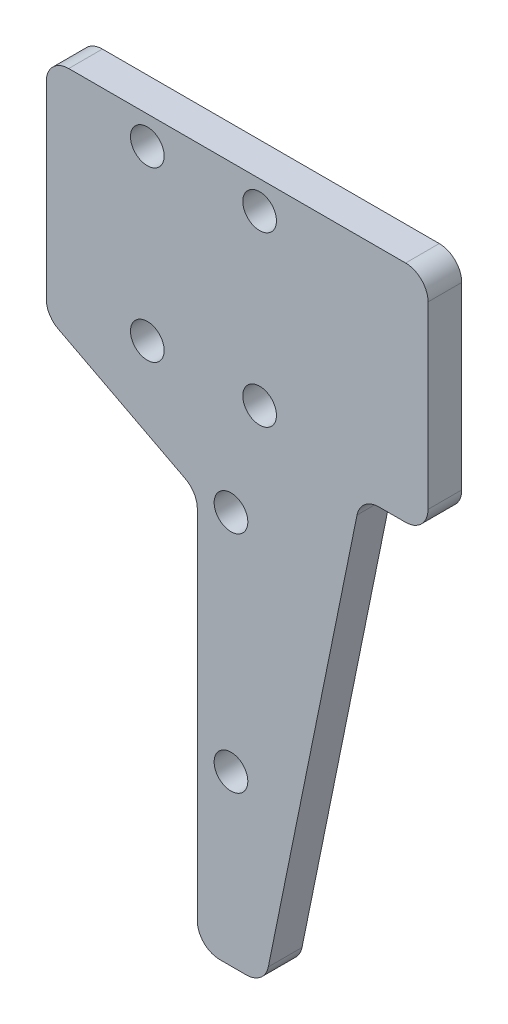
ISO-10303-21;
HEADER;
FILE_DESCRIPTION(('STEP AP214'),'2;1');
FILE_NAME('part.step','',(''),(''),'','','');
FILE_SCHEMA(('AUTOMOTIVE_DESIGN { 1 0 10303 214 1 1 1 1 }'));
ENDSEC;
DATA;
#1=APPLICATION_CONTEXT('core data for automotive mechanical design processes');
#2=APPLICATION_PROTOCOL_DEFINITION('international standard','automotive_design',2000,#1);
#3=PRODUCT_CONTEXT('',#1,'mechanical');
#4=PRODUCT('Part','Part','',(#3));
#5=PRODUCT_RELATED_PRODUCT_CATEGORY('part','',(#4));
#6=PRODUCT_DEFINITION_FORMATION('','',#4);
#7=PRODUCT_DEFINITION_CONTEXT('part definition',#1,'design');
#8=PRODUCT_DEFINITION('design','',#6,#7);
#9=PRODUCT_DEFINITION_SHAPE('','',#8);
#10=(LENGTH_UNIT() NAMED_UNIT(*) SI_UNIT(.MILLI.,.METRE.));
#11=(NAMED_UNIT(*) PLANE_ANGLE_UNIT() SI_UNIT($,.RADIAN.));
#12=(NAMED_UNIT(*) SI_UNIT($,.STERADIAN.) SOLID_ANGLE_UNIT());
#13=UNCERTAINTY_MEASURE_WITH_UNIT(LENGTH_MEASURE(1.E-05),#10,'distance_accuracy_value','');
#14=(GEOMETRIC_REPRESENTATION_CONTEXT(3) GLOBAL_UNCERTAINTY_ASSIGNED_CONTEXT((#13)) GLOBAL_UNIT_ASSIGNED_CONTEXT((#10,
#11,#12)) REPRESENTATION_CONTEXT('',''));
#15=CARTESIAN_POINT('',(0.,0.,0.));
#16=DIRECTION('',(0.,0.,1.));
#17=DIRECTION('',(1.,0.,0.));
#18=AXIS2_PLACEMENT_3D('',#15,#16,#17);
#19=CARTESIAN_POINT('',(0.,-52.,3.));
#20=DIRECTION('',(0.,1.,0.));
#21=DIRECTION('',(0.,0.,1.));
#22=AXIS2_PLACEMENT_3D('',#19,#20,#21);
#23=PLANE('',#22);
#24=DIRECTION('',(1.,0.,0.));
#25=VECTOR('',#24,1.);
#26=CARTESIAN_POINT('',(0.,-52.,3.));
#27=LINE('',#26,#25);
#28=CARTESIAN_POINT('',(1.45,-52.,3.));
#29=VERTEX_POINT('',#28);
#30=CARTESIAN_POINT('',(3.81612220410614,-52.,3.));
#31=VERTEX_POINT('',#30);
#32=EDGE_CURVE('E181',#29,#31,#27,.T.);
#33=ORIENTED_EDGE('',*,*,#32,.F.);
#34=DIRECTION('',(0.,0.,-1.));
#35=VECTOR('',#34,1.);
#36=CARTESIAN_POINT('',(1.45,-52.,3.));
#37=LINE('',#36,#35);
#38=CARTESIAN_POINT('',(1.45,-52.,0.));
#39=VERTEX_POINT('',#38);
#40=EDGE_CURVE('E166',#29,#39,#37,.T.);
#41=ORIENTED_EDGE('',*,*,#40,.T.);
#42=DIRECTION('',(1.,0.,0.));
#43=VECTOR('',#42,1.);
#44=CARTESIAN_POINT('',(0.,-52.,0.));
#45=LINE('',#44,#43);
#46=CARTESIAN_POINT('',(3.81612220410614,-52.,0.));
#47=VERTEX_POINT('',#46);
#48=EDGE_CURVE('E178',#39,#47,#45,.T.);
#49=ORIENTED_EDGE('',*,*,#48,.T.);
#50=DIRECTION('',(0.,0.,-1.));
#51=VECTOR('',#50,1.);
#52=CARTESIAN_POINT('',(3.81612220410614,-52.,3.));
#53=LINE('',#52,#51);
#54=EDGE_CURVE('E183',#47,#31,#53,.F.);
#55=ORIENTED_EDGE('',*,*,#54,.T.);
#56=EDGE_LOOP('',(#33,#41,#49,#55));
#57=FACE_BOUND('',#56,.T.);
#58=ADVANCED_FACE('F48',(#57),#23,.F.);
#59=CARTESIAN_POINT('',(15.3976166272704,-3.13451481340862,3.));
#60=DIRECTION('',(0.979901892234314,-0.199480028061985,0.));
#61=DIRECTION('',(0.199480028061986,0.979901892234314,0.));
#62=AXIS2_PLACEMENT_3D('',#59,#60,#61);
#63=PLANE('',#62);
#64=DIRECTION('',(-0.199480028061986,-0.979901892234314,0.));
#65=VECTOR('',#64,1.);
#66=CARTESIAN_POINT('',(15.3976166272704,-3.13451481340862,3.));
#67=LINE('',#66,#65);
#68=CARTESIAN_POINT('',(13.6740740114252,-11.601039943876,3.));
#69=VERTEX_POINT('',#68);
#70=CARTESIAN_POINT('',(5.77592598857476,-50.398960056124,3.));
#71=VERTEX_POINT('',#70);
#72=EDGE_CURVE('E295',#69,#71,#67,.T.);
#73=ORIENTED_EDGE('',*,*,#72,.T.);
#74=DIRECTION('',(0.,0.,-1.));
#75=VECTOR('',#74,1.);
#76=CARTESIAN_POINT('',(5.77592598857476,-50.398960056124,0.));
#77=LINE('',#76,#75);
#78=CARTESIAN_POINT('',(5.77592598857476,-50.398960056124,0.));
#79=VERTEX_POINT('',#78);
#80=EDGE_CURVE('E270',#71,#79,#77,.T.);
#81=ORIENTED_EDGE('',*,*,#80,.T.);
#82=DIRECTION('',(-0.199480028061986,-0.979901892234314,0.));
#83=VECTOR('',#82,1.);
#84=CARTESIAN_POINT('',(15.3976166272704,-3.13451481340862,0.));
#85=LINE('',#84,#83);
#86=CARTESIAN_POINT('',(13.6740740114252,-11.601039943876,0.));
#87=VERTEX_POINT('',#86);
#88=EDGE_CURVE('E188',#87,#79,#85,.T.);
#89=ORIENTED_EDGE('',*,*,#88,.F.);
#90=DIRECTION('',(0.,0.,-1.));
#91=VECTOR('',#90,1.);
#92=CARTESIAN_POINT('',(13.6740740114252,-11.601039943876,3.));
#93=LINE('',#92,#91);
#94=EDGE_CURVE('E268',#87,#69,#93,.F.);
#95=ORIENTED_EDGE('',*,*,#94,.T.);
#96=EDGE_LOOP('',(#73,#81,#89,#95));
#97=FACE_BOUND('',#96,.T.);
#98=ADVANCED_FACE('F285',(#97),#63,.T.);
#99=CARTESIAN_POINT('',(0.,10.,3.));
#100=DIRECTION('',(0.,1.,0.));
#101=DIRECTION('',(0.,0.,1.));
#102=AXIS2_PLACEMENT_3D('',#99,#100,#101);
#103=PLANE('',#102);
#104=DIRECTION('',(1.,0.,0.));
#105=VECTOR('',#104,1.);
#106=CARTESIAN_POINT('',(0.,10.,0.));
#107=LINE('',#106,#105);
#108=CARTESIAN_POINT('',(-12.,10.,0.));
#109=VERTEX_POINT('',#108);
#110=CARTESIAN_POINT('',(18.,10.,0.));
#111=VERTEX_POINT('',#110);
#112=EDGE_CURVE('E191',#109,#111,#107,.T.);
#113=ORIENTED_EDGE('',*,*,#112,.F.);
#114=DIRECTION('',(0.,0.,-1.));
#115=VECTOR('',#114,1.);
#116=CARTESIAN_POINT('',(-12.,10.,3.));
#117=LINE('',#116,#115);
#118=CARTESIAN_POINT('',(-12.,10.,3.));
#119=VERTEX_POINT('',#118);
#120=EDGE_CURVE('E255',#109,#119,#117,.F.);
#121=ORIENTED_EDGE('',*,*,#120,.T.);
#122=DIRECTION('',(1.,0.,0.));
#123=VECTOR('',#122,1.);
#124=CARTESIAN_POINT('',(0.,10.,3.));
#125=LINE('',#124,#123);
#126=CARTESIAN_POINT('',(18.,10.,3.));
#127=VERTEX_POINT('',#126);
#128=EDGE_CURVE('E317',#119,#127,#125,.T.);
#129=ORIENTED_EDGE('',*,*,#128,.T.);
#130=DIRECTION('',(0.,0.,1.));
#131=VECTOR('',#130,1.);
#132=CARTESIAN_POINT('',(18.,10.,3.));
#133=LINE('',#132,#131);
#134=EDGE_CURVE('E253',#127,#111,#133,.F.);
#135=ORIENTED_EDGE('',*,*,#134,.T.);
#136=EDGE_LOOP('',(#113,#121,#129,#135));
#137=FACE_BOUND('',#136,.T.);
#138=ADVANCED_FACE('F362',(#137),#103,.T.);
#139=CARTESIAN_POINT('',(-14.,0.,3.));
#140=DIRECTION('',(-1.,0.,0.));
#141=DIRECTION('',(0.,0.,1.));
#142=AXIS2_PLACEMENT_3D('',#139,#140,#141);
#143=PLANE('',#142);
#144=DIRECTION('',(0.,1.,0.));
#145=VECTOR('',#144,1.);
#146=CARTESIAN_POINT('',(-14.,0.,0.));
#147=LINE('',#146,#145);
#148=CARTESIAN_POINT('',(-14.,-8.78623998995418,0.));
#149=VERTEX_POINT('',#148);
#150=CARTESIAN_POINT('',(-14.,8.,0.));
#151=VERTEX_POINT('',#150);
#152=EDGE_CURVE('E202',#149,#151,#147,.T.);
#153=ORIENTED_EDGE('',*,*,#152,.F.);
#154=DIRECTION('',(0.,0.,-1.));
#155=VECTOR('',#154,1.);
#156=CARTESIAN_POINT('',(-14.,-8.78623998995418,3.));
#157=LINE('',#156,#155);
#158=CARTESIAN_POINT('',(-14.,-8.78623998995418,3.));
#159=VERTEX_POINT('',#158);
#160=EDGE_CURVE('E251',#149,#159,#157,.F.);
#161=ORIENTED_EDGE('',*,*,#160,.T.);
#162=DIRECTION('',(0.,1.,0.));
#163=VECTOR('',#162,1.);
#164=CARTESIAN_POINT('',(-14.,0.,3.));
#165=LINE('',#164,#163);
#166=CARTESIAN_POINT('',(-14.,8.,3.));
#167=VERTEX_POINT('',#166);
#168=EDGE_CURVE('E320',#159,#167,#165,.T.);
#169=ORIENTED_EDGE('',*,*,#168,.T.);
#170=DIRECTION('',(0.,0.,-1.));
#171=VECTOR('',#170,1.);
#172=CARTESIAN_POINT('',(-14.,8.,3.));
#173=LINE('',#172,#171);
#174=EDGE_CURVE('E248',#167,#151,#173,.T.);
#175=ORIENTED_EDGE('',*,*,#174,.T.);
#176=EDGE_LOOP('',(#153,#161,#169,#175));
#177=FACE_BOUND('',#176,.T.);
#178=ADVANCED_FACE('F404',(#177),#143,.T.);
#179=CARTESIAN_POINT('',(-7.07908787420755,-13.6019617011559,3.));
#180=DIRECTION('',(0.461664194486388,0.887054773691701,0.));
#181=DIRECTION('',(-0.887054773691701,0.461664194486388,0.));
#182=AXIS2_PLACEMENT_3D('',#179,#180,#181);
#183=PLANE('',#182);
#184=DIRECTION('',(0.887054773691701,-0.461664194486388,0.));
#185=VECTOR('',#184,1.);
#186=CARTESIAN_POINT('',(-7.07908787420755,-13.6019617011559,0.));
#187=LINE('',#186,#185);
#188=CARTESIAN_POINT('',(-12.9233283889728,-10.5603495373376,0.));
#189=VERTEX_POINT('',#188);
#190=CARTESIAN_POINT('',(-1.62667161102723,-16.4396504626624,0.));
#191=VERTEX_POINT('',#190);
#192=EDGE_CURVE('E205',#189,#191,#187,.T.);
#193=ORIENTED_EDGE('',*,*,#192,.T.);
#194=DIRECTION('',(0.,0.,-1.));
#195=VECTOR('',#194,1.);
#196=CARTESIAN_POINT('',(-1.62667161102723,-16.4396504626624,3.));
#197=LINE('',#196,#195);
#198=CARTESIAN_POINT('',(-1.62667161102723,-16.4396504626624,3.));
#199=VERTEX_POINT('',#198);
#200=EDGE_CURVE('E63',#191,#199,#197,.F.);
#201=ORIENTED_EDGE('',*,*,#200,.T.);
#202=DIRECTION('',(0.887054773691701,-0.461664194486388,0.));
#203=VECTOR('',#202,1.);
#204=CARTESIAN_POINT('',(-7.07908787420755,-13.6019617011559,3.));
#205=LINE('',#204,#203);
#206=CARTESIAN_POINT('',(-12.9233283889728,-10.5603495373376,3.));
#207=VERTEX_POINT('',#206);
#208=EDGE_CURVE('E323',#207,#199,#205,.T.);
#209=ORIENTED_EDGE('',*,*,#208,.F.);
#210=DIRECTION('',(0.,0.,-1.));
#211=VECTOR('',#210,1.);
#212=CARTESIAN_POINT('',(-12.9233283889728,-10.5603495373376,0.));
#213=LINE('',#212,#211);
#214=EDGE_CURVE('E244',#207,#189,#213,.T.);
#215=ORIENTED_EDGE('',*,*,#214,.T.);
#216=EDGE_LOOP('',(#193,#201,#209,#215));
#217=FACE_BOUND('',#216,.T.);
#218=ADVANCED_FACE('F399',(#217),#183,.F.);
#219=CARTESIAN_POINT('',(5.,-7.5,3.));
#220=DIRECTION('',(0.,0.,-1.));
#221=DIRECTION('',(-1.,0.,0.));
#222=AXIS2_PLACEMENT_3D('',#219,#220,#221);
#223=CYLINDRICAL_SURFACE('',#222,1.5);
#224=CARTESIAN_POINT('',(5.,-7.5,3.));
#225=DIRECTION('',(0.,0.,1.));
#226=DIRECTION('',(1.,0.,0.));
#227=AXIS2_PLACEMENT_3D('',#224,#225,#226);
#228=CIRCLE('',#227,1.5);
#229=CARTESIAN_POINT('',(6.5,-7.5,3.));
#230=VERTEX_POINT('',#229);
#231=EDGE_CURVE('E332',#230,#230,#228,.T.);
#232=ORIENTED_EDGE('',*,*,#231,.T.);
#233=EDGE_LOOP('',(#232));
#234=FACE_BOUND('',#233,.T.);
#235=CARTESIAN_POINT('',(5.,-7.5,0.));
#236=DIRECTION('',(0.,0.,1.));
#237=DIRECTION('',(1.,0.,0.));
#238=AXIS2_PLACEMENT_3D('',#235,#236,#237);
#239=CIRCLE('',#238,1.5);
#240=CARTESIAN_POINT('',(6.5,-7.5,0.));
#241=VERTEX_POINT('',#240);
#242=EDGE_CURVE('E215',#241,#241,#239,.T.);
#243=ORIENTED_EDGE('',*,*,#242,.F.);
#244=EDGE_LOOP('',(#243));
#245=FACE_BOUND('',#244,.T.);
#246=ADVANCED_FACE('F486',(#234,#245),#223,.F.);
#247=CARTESIAN_POINT('',(-5.,-7.5,3.));
#248=DIRECTION('',(0.,0.,-1.));
#249=DIRECTION('',(-1.,0.,0.));
#250=AXIS2_PLACEMENT_3D('',#247,#248,#249);
#251=CYLINDRICAL_SURFACE('',#250,1.5);
#252=CARTESIAN_POINT('',(-5.,-7.5,3.));
#253=DIRECTION('',(0.,0.,1.));
#254=DIRECTION('',(1.,0.,0.));
#255=AXIS2_PLACEMENT_3D('',#252,#253,#254);
#256=CIRCLE('',#255,1.5);
#257=CARTESIAN_POINT('',(-3.5,-7.5,3.));
#258=VERTEX_POINT('',#257);
#259=EDGE_CURVE('E330',#258,#258,#256,.T.);
#260=ORIENTED_EDGE('',*,*,#259,.T.);
#261=EDGE_LOOP('',(#260));
#262=FACE_BOUND('',#261,.T.);
#263=CARTESIAN_POINT('',(-5.,-7.5,0.));
#264=DIRECTION('',(0.,0.,1.));
#265=DIRECTION('',(1.,0.,0.));
#266=AXIS2_PLACEMENT_3D('',#263,#264,#265);
#267=CIRCLE('',#266,1.5);
#268=CARTESIAN_POINT('',(-3.5,-7.5,0.));
#269=VERTEX_POINT('',#268);
#270=EDGE_CURVE('E212',#269,#269,#267,.T.);
#271=ORIENTED_EDGE('',*,*,#270,.F.);
#272=EDGE_LOOP('',(#271));
#273=FACE_BOUND('',#272,.T.);
#274=ADVANCED_FACE('F616',(#262,#273),#251,.F.);
#275=CARTESIAN_POINT('',(-5.,7.5,3.));
#276=DIRECTION('',(0.,0.,-1.));
#277=DIRECTION('',(-1.,0.,0.));
#278=AXIS2_PLACEMENT_3D('',#275,#276,#277);
#279=CYLINDRICAL_SURFACE('',#278,1.5);
#280=CARTESIAN_POINT('',(-5.,7.5,3.));
#281=DIRECTION('',(0.,0.,1.));
#282=DIRECTION('',(1.,0.,0.));
#283=AXIS2_PLACEMENT_3D('',#280,#281,#282);
#284=CIRCLE('',#283,1.5);
#285=CARTESIAN_POINT('',(-3.5,7.5,3.));
#286=VERTEX_POINT('',#285);
#287=EDGE_CURVE('E327',#286,#286,#284,.T.);
#288=ORIENTED_EDGE('',*,*,#287,.T.);
#289=EDGE_LOOP('',(#288));
#290=FACE_BOUND('',#289,.T.);
#291=CARTESIAN_POINT('',(-5.,7.5,0.));
#292=DIRECTION('',(0.,0.,1.));
#293=DIRECTION('',(1.,0.,0.));
#294=AXIS2_PLACEMENT_3D('',#291,#292,#293);
#295=CIRCLE('',#294,1.5);
#296=CARTESIAN_POINT('',(-3.5,7.5,0.));
#297=VERTEX_POINT('',#296);
#298=EDGE_CURVE('E209',#297,#297,#295,.T.);
#299=ORIENTED_EDGE('',*,*,#298,.F.);
#300=EDGE_LOOP('',(#299));
#301=FACE_BOUND('',#300,.T.);
#302=ADVANCED_FACE('F497',(#290,#301),#279,.F.);
#303=CARTESIAN_POINT('',(-0.550000000000006,0.,3.));
#304=DIRECTION('',(1.,0.,0.));
#305=DIRECTION('',(0.,1.,0.));
#306=AXIS2_PLACEMENT_3D('',#303,#304,#305);
#307=PLANE('',#306);
#308=DIRECTION('',(0.,-1.,0.));
#309=VECTOR('',#308,1.);
#310=CARTESIAN_POINT('',(-0.550000000000006,0.,0.));
#311=LINE('',#310,#309);
#312=CARTESIAN_POINT('',(-0.550000000000003,-18.2137600100458,0.));
#313=VERTEX_POINT('',#312);
#314=CARTESIAN_POINT('',(-0.549999999999999,-50.,0.));
#315=VERTEX_POINT('',#314);
#316=EDGE_CURVE('E207',#313,#315,#311,.T.);
#317=ORIENTED_EDGE('',*,*,#316,.T.);
#318=DIRECTION('',(0.,0.,-1.));
#319=VECTOR('',#318,1.);
#320=CARTESIAN_POINT('',(-0.549999999999999,-50.,3.));
#321=LINE('',#320,#319);
#322=CARTESIAN_POINT('',(-0.549999999999999,-50.,3.));
#323=VERTEX_POINT('',#322);
#324=EDGE_CURVE('E167',#315,#323,#321,.F.);
#325=ORIENTED_EDGE('',*,*,#324,.T.);
#326=DIRECTION('',(0.,-1.,0.));
#327=VECTOR('',#326,1.);
#328=CARTESIAN_POINT('',(-0.550000000000006,0.,3.));
#329=LINE('',#328,#327);
#330=CARTESIAN_POINT('',(-0.550000000000003,-18.2137600100458,3.));
#331=VERTEX_POINT('',#330);
#332=EDGE_CURVE('E325',#331,#323,#329,.T.);
#333=ORIENTED_EDGE('',*,*,#332,.F.);
#334=DIRECTION('',(0.,0.,-1.));
#335=VECTOR('',#334,1.);
#336=CARTESIAN_POINT('',(-0.550000000000003,-18.2137600100458,0.));
#337=LINE('',#336,#335);
#338=EDGE_CURVE('E172',#331,#313,#337,.T.);
#339=ORIENTED_EDGE('',*,*,#338,.T.);
#340=EDGE_LOOP('',(#317,#325,#333,#339));
#341=FACE_BOUND('',#340,.T.);
#342=ADVANCED_FACE('F352',(#341),#307,.F.);
#343=CARTESIAN_POINT('',(5.,7.5,3.));
#344=DIRECTION('',(0.,0.,-1.));
#345=DIRECTION('',(-1.,0.,0.));
#346=AXIS2_PLACEMENT_3D('',#343,#344,#345);
#347=CYLINDRICAL_SURFACE('',#346,1.5);
#348=CARTESIAN_POINT('',(5.,7.5,3.));
#349=DIRECTION('',(0.,0.,1.));
#350=DIRECTION('',(1.,0.,0.));
#351=AXIS2_PLACEMENT_3D('',#348,#349,#350);
#352=CIRCLE('',#351,1.5);
#353=CARTESIAN_POINT('',(6.5,7.5,3.));
#354=VERTEX_POINT('',#353);
#355=EDGE_CURVE('E197',#354,#354,#352,.T.);
#356=ORIENTED_EDGE('',*,*,#355,.T.);
#357=EDGE_LOOP('',(#356));
#358=FACE_BOUND('',#357,.T.);
#359=CARTESIAN_POINT('',(5.,7.5,0.));
#360=DIRECTION('',(0.,0.,1.));
#361=DIRECTION('',(1.,0.,0.));
#362=AXIS2_PLACEMENT_3D('',#359,#360,#361);
#363=CIRCLE('',#362,1.5);
#364=CARTESIAN_POINT('',(6.5,7.5,0.));
#365=VERTEX_POINT('',#364);
#366=EDGE_CURVE('E218',#365,#365,#363,.T.);
#367=ORIENTED_EDGE('',*,*,#366,.F.);
#368=EDGE_LOOP('',(#367));
#369=FACE_BOUND('',#368,.T.);
#370=ADVANCED_FACE('F339',(#358,#369),#347,.F.);
#371=CARTESIAN_POINT('',(0.,0.,3.));
#372=DIRECTION('',(0.,0.,1.));
#373=DIRECTION('',(1.,0.,0.));
#374=AXIS2_PLACEMENT_3D('',#371,#372,#373);
#375=PLANE('',#374);
#376=CARTESIAN_POINT('',(2.44999999999999,-37.,3.));
#377=DIRECTION('',(0.,0.,1.));
#378=DIRECTION('',(1.,0.,0.));
#379=AXIS2_PLACEMENT_3D('',#376,#377,#378);
#380=CIRCLE('',#379,1.5);
#381=CARTESIAN_POINT('',(3.95,-37.,3.));
#382=VERTEX_POINT('',#381);
#383=EDGE_CURVE('E194',#382,#382,#380,.T.);
#384=ORIENTED_EDGE('',*,*,#383,.F.);
#385=EDGE_LOOP('',(#384));
#386=FACE_BOUND('',#385,.T.);
#387=CARTESIAN_POINT('',(2.44999999999999,-17.,3.));
#388=DIRECTION('',(0.,0.,1.));
#389=DIRECTION('',(1.,0.,0.));
#390=AXIS2_PLACEMENT_3D('',#387,#388,#389);
#391=CIRCLE('',#390,1.5);
#392=CARTESIAN_POINT('',(3.94999999999999,-17.,3.));
#393=VERTEX_POINT('',#392);
#394=EDGE_CURVE('E309',#393,#393,#391,.T.);
#395=ORIENTED_EDGE('',*,*,#394,.F.);
#396=EDGE_LOOP('',(#395));
#397=FACE_BOUND('',#396,.T.);
#398=ORIENTED_EDGE('',*,*,#332,.T.);
#399=CARTESIAN_POINT('',(1.45,-50.,3.));
#400=DIRECTION('',(0.,0.,1.));
#401=DIRECTION('',(1.,0.,0.));
#402=AXIS2_PLACEMENT_3D('',#399,#400,#401);
#403=CIRCLE('',#402,2.);
#404=EDGE_CURVE('E242',#323,#29,#403,.T.);
#405=ORIENTED_EDGE('',*,*,#404,.T.);
#406=ORIENTED_EDGE('',*,*,#32,.T.);
#407=CARTESIAN_POINT('',(3.81612220410614,-50.,3.));
#408=DIRECTION('',(0.,0.,1.));
#409=DIRECTION('',(1.,0.,0.));
#410=AXIS2_PLACEMENT_3D('',#407,#408,#409);
#411=CIRCLE('',#410,2.);
#412=EDGE_CURVE('E233',#31,#71,#411,.T.);
#413=ORIENTED_EDGE('',*,*,#412,.T.);
#414=ORIENTED_EDGE('',*,*,#72,.F.);
#415=CARTESIAN_POINT('',(15.6338777958939,-12.,3.));
#416=DIRECTION('',(0.,0.,1.));
#417=DIRECTION('',(1.,0.,0.));
#418=AXIS2_PLACEMENT_3D('',#415,#416,#417);
#419=CIRCLE('',#418,2.);
#420=CARTESIAN_POINT('',(15.6338777958939,-10.,3.));
#421=VERTEX_POINT('',#420);
#422=EDGE_CURVE('E11',#69,#421,#419,.F.);
#423=ORIENTED_EDGE('',*,*,#422,.T.);
#424=DIRECTION('',(1.,0.,0.));
#425=VECTOR('',#424,1.);
#426=CARTESIAN_POINT('',(14.,-10.,3.));
#427=LINE('',#426,#425);
#428=CARTESIAN_POINT('',(18.,-10.,3.));
#429=VERTEX_POINT('',#428);
#430=EDGE_CURVE('E294',#421,#429,#427,.T.);
#431=ORIENTED_EDGE('',*,*,#430,.T.);
#432=CARTESIAN_POINT('',(18.,-8.,3.));
#433=DIRECTION('',(0.,0.,1.));
#434=DIRECTION('',(1.,0.,0.));
#435=AXIS2_PLACEMENT_3D('',#432,#433,#434);
#436=CIRCLE('',#435,2.);
#437=CARTESIAN_POINT('',(20.,-8.,3.));
#438=VERTEX_POINT('',#437);
#439=EDGE_CURVE('E235',#429,#438,#436,.T.);
#440=ORIENTED_EDGE('',*,*,#439,.T.);
#441=DIRECTION('',(0.,1.,0.));
#442=VECTOR('',#441,1.);
#443=CARTESIAN_POINT('',(20.,-10.,3.));
#444=LINE('',#443,#442);
#445=CARTESIAN_POINT('',(20.,8.00000000000001,3.));
#446=VERTEX_POINT('',#445);
#447=EDGE_CURVE('E299',#438,#446,#444,.T.);
#448=ORIENTED_EDGE('',*,*,#447,.T.);
#449=CARTESIAN_POINT('',(18.,8.00000000000001,3.));
#450=DIRECTION('',(0.,0.,1.));
#451=DIRECTION('',(1.,0.,0.));
#452=AXIS2_PLACEMENT_3D('',#449,#450,#451);
#453=CIRCLE('',#452,2.);
#454=EDGE_CURVE('E237',#446,#127,#453,.T.);
#455=ORIENTED_EDGE('',*,*,#454,.T.);
#456=ORIENTED_EDGE('',*,*,#128,.F.);
#457=CARTESIAN_POINT('',(-12.,8.,3.));
#458=DIRECTION('',(0.,0.,1.));
#459=DIRECTION('',(1.,0.,0.));
#460=AXIS2_PLACEMENT_3D('',#457,#458,#459);
#461=CIRCLE('',#460,2.);
#462=EDGE_CURVE('E239',#119,#167,#461,.T.);
#463=ORIENTED_EDGE('',*,*,#462,.T.);
#464=ORIENTED_EDGE('',*,*,#168,.F.);
#465=CARTESIAN_POINT('',(-12.,-8.78623998995418,3.));
#466=DIRECTION('',(0.,0.,1.));
#467=DIRECTION('',(1.,0.,0.));
#468=AXIS2_PLACEMENT_3D('',#465,#466,#467);
#469=CIRCLE('',#468,2.);
#470=EDGE_CURVE('E70',#159,#207,#469,.T.);
#471=ORIENTED_EDGE('',*,*,#470,.T.);
#472=ORIENTED_EDGE('',*,*,#208,.T.);
#473=CARTESIAN_POINT('',(-2.55,-18.2137600100458,3.));
#474=DIRECTION('',(0.,0.,1.));
#475=DIRECTION('',(1.,0.,0.));
#476=AXIS2_PLACEMENT_3D('',#473,#474,#475);
#477=CIRCLE('',#476,2.);
#478=EDGE_CURVE('E275',#199,#331,#477,.F.);
#479=ORIENTED_EDGE('',*,*,#478,.T.);
#480=EDGE_LOOP('',(#398,#405,#406,#413,#414,#423,#431,#440,#448,#455,#456,#463,#464,#471,#472,#479));
#481=FACE_BOUND('',#480,.T.);
#482=ORIENTED_EDGE('',*,*,#287,.F.);
#483=EDGE_LOOP('',(#482));
#484=FACE_BOUND('',#483,.T.);
#485=ORIENTED_EDGE('',*,*,#259,.F.);
#486=EDGE_LOOP('',(#485));
#487=FACE_BOUND('',#486,.T.);
#488=ORIENTED_EDGE('',*,*,#231,.F.);
#489=EDGE_LOOP('',(#488));
#490=FACE_BOUND('',#489,.T.);
#491=ORIENTED_EDGE('',*,*,#355,.F.);
#492=EDGE_LOOP('',(#491));
#493=FACE_BOUND('',#492,.T.);
#494=ADVANCED_FACE('F292',(#386,#397,#481,#484,#487,#490,#493),#375,.T.);
#495=CARTESIAN_POINT('',(0.,0.,0.));
#496=DIRECTION('',(0.,0.,1.));
#497=DIRECTION('',(1.,0.,0.));
#498=AXIS2_PLACEMENT_3D('',#495,#496,#497);
#499=PLANE('',#498);
#500=CARTESIAN_POINT('',(2.44999999999999,-37.,0.));
#501=DIRECTION('',(0.,0.,1.));
#502=DIRECTION('',(1.,0.,0.));
#503=AXIS2_PLACEMENT_3D('',#500,#501,#502);
#504=CIRCLE('',#503,1.5);
#505=CARTESIAN_POINT('',(3.95,-37.,0.));
#506=VERTEX_POINT('',#505);
#507=EDGE_CURVE('E189',#506,#506,#504,.T.);
#508=ORIENTED_EDGE('',*,*,#507,.T.);
#509=EDGE_LOOP('',(#508));
#510=FACE_BOUND('',#509,.T.);
#511=CARTESIAN_POINT('',(2.44999999999999,-17.,0.));
#512=DIRECTION('',(0.,0.,1.));
#513=DIRECTION('',(1.,0.,0.));
#514=AXIS2_PLACEMENT_3D('',#511,#512,#513);
#515=CIRCLE('',#514,1.5);
#516=CARTESIAN_POINT('',(3.94999999999999,-17.,0.));
#517=VERTEX_POINT('',#516);
#518=EDGE_CURVE('E312',#517,#517,#515,.T.);
#519=ORIENTED_EDGE('',*,*,#518,.T.);
#520=EDGE_LOOP('',(#519));
#521=FACE_BOUND('',#520,.T.);
#522=ORIENTED_EDGE('',*,*,#48,.F.);
#523=CARTESIAN_POINT('',(1.45,-50.,0.));
#524=DIRECTION('',(0.,0.,1.));
#525=DIRECTION('',(1.,0.,0.));
#526=AXIS2_PLACEMENT_3D('',#523,#524,#525);
#527=CIRCLE('',#526,2.);
#528=EDGE_CURVE('E162',#39,#315,#527,.F.);
#529=ORIENTED_EDGE('',*,*,#528,.T.);
#530=ORIENTED_EDGE('',*,*,#316,.F.);
#531=CARTESIAN_POINT('',(-2.55,-18.2137600100458,0.));
#532=DIRECTION('',(0.,0.,1.));
#533=DIRECTION('',(1.,0.,0.));
#534=AXIS2_PLACEMENT_3D('',#531,#532,#533);
#535=CIRCLE('',#534,2.);
#536=EDGE_CURVE('E273',#313,#191,#535,.T.);
#537=ORIENTED_EDGE('',*,*,#536,.T.);
#538=ORIENTED_EDGE('',*,*,#192,.F.);
#539=CARTESIAN_POINT('',(-12.,-8.78623998995418,0.));
#540=DIRECTION('',(0.,0.,1.));
#541=DIRECTION('',(1.,0.,0.));
#542=AXIS2_PLACEMENT_3D('',#539,#540,#541);
#543=CIRCLE('',#542,2.);
#544=EDGE_CURVE('E173',#189,#149,#543,.F.);
#545=ORIENTED_EDGE('',*,*,#544,.T.);
#546=ORIENTED_EDGE('',*,*,#152,.T.);
#547=CARTESIAN_POINT('',(-12.,8.,0.));
#548=DIRECTION('',(0.,0.,1.));
#549=DIRECTION('',(1.,0.,0.));
#550=AXIS2_PLACEMENT_3D('',#547,#548,#549);
#551=CIRCLE('',#550,2.);
#552=EDGE_CURVE('E227',#151,#109,#551,.F.);
#553=ORIENTED_EDGE('',*,*,#552,.T.);
#554=ORIENTED_EDGE('',*,*,#112,.T.);
#555=CARTESIAN_POINT('',(18.,8.00000000000001,0.));
#556=DIRECTION('',(0.,0.,1.));
#557=DIRECTION('',(1.,0.,0.));
#558=AXIS2_PLACEMENT_3D('',#555,#556,#557);
#559=CIRCLE('',#558,2.);
#560=CARTESIAN_POINT('',(20.,8.00000000000001,0.));
#561=VERTEX_POINT('',#560);
#562=EDGE_CURVE('E225',#111,#561,#559,.F.);
#563=ORIENTED_EDGE('',*,*,#562,.T.);
#564=DIRECTION('',(0.,1.,0.));
#565=VECTOR('',#564,1.);
#566=CARTESIAN_POINT('',(20.,-10.,0.));
#567=LINE('',#566,#565);
#568=CARTESIAN_POINT('',(20.,-8.,0.));
#569=VERTEX_POINT('',#568);
#570=EDGE_CURVE('E304',#569,#561,#567,.T.);
#571=ORIENTED_EDGE('',*,*,#570,.F.);
#572=CARTESIAN_POINT('',(18.,-8.,0.));
#573=DIRECTION('',(0.,0.,1.));
#574=DIRECTION('',(1.,0.,0.));
#575=AXIS2_PLACEMENT_3D('',#572,#573,#574);
#576=CIRCLE('',#575,2.);
#577=CARTESIAN_POINT('',(18.,-10.,0.));
#578=VERTEX_POINT('',#577);
#579=EDGE_CURVE('E223',#569,#578,#576,.F.);
#580=ORIENTED_EDGE('',*,*,#579,.T.);
#581=DIRECTION('',(1.,0.,0.));
#582=VECTOR('',#581,1.);
#583=CARTESIAN_POINT('',(14.,-10.,0.));
#584=LINE('',#583,#582);
#585=CARTESIAN_POINT('',(15.6338777958939,-10.,0.));
#586=VERTEX_POINT('',#585);
#587=EDGE_CURVE('E279',#586,#578,#584,.T.);
#588=ORIENTED_EDGE('',*,*,#587,.F.);
#589=CARTESIAN_POINT('',(15.6338777958939,-12.,0.));
#590=DIRECTION('',(0.,0.,1.));
#591=DIRECTION('',(1.,0.,0.));
#592=AXIS2_PLACEMENT_3D('',#589,#590,#591);
#593=CIRCLE('',#592,2.);
#594=EDGE_CURVE('E56',#586,#87,#593,.T.);
#595=ORIENTED_EDGE('',*,*,#594,.T.);
#596=ORIENTED_EDGE('',*,*,#88,.T.);
#597=CARTESIAN_POINT('',(3.81612220410614,-50.,0.));
#598=DIRECTION('',(0.,0.,1.));
#599=DIRECTION('',(1.,0.,0.));
#600=AXIS2_PLACEMENT_3D('',#597,#598,#599);
#601=CIRCLE('',#600,2.);
#602=EDGE_CURVE('E182',#79,#47,#601,.F.);
#603=ORIENTED_EDGE('',*,*,#602,.T.);
#604=EDGE_LOOP('',(#522,#529,#530,#537,#538,#545,#546,#553,#554,#563,#571,#580,#588,#595,#596,#603));
#605=FACE_BOUND('',#604,.T.);
#606=ORIENTED_EDGE('',*,*,#298,.T.);
#607=EDGE_LOOP('',(#606));
#608=FACE_BOUND('',#607,.T.);
#609=ORIENTED_EDGE('',*,*,#270,.T.);
#610=EDGE_LOOP('',(#609));
#611=FACE_BOUND('',#610,.T.);
#612=ORIENTED_EDGE('',*,*,#242,.T.);
#613=EDGE_LOOP('',(#612));
#614=FACE_BOUND('',#613,.T.);
#615=ORIENTED_EDGE('',*,*,#366,.T.);
#616=EDGE_LOOP('',(#615));
#617=FACE_BOUND('',#616,.T.);
#618=ADVANCED_FACE('F185',(#510,#521,#605,#608,#611,#614,#617),#499,.F.);
#619=CARTESIAN_POINT('',(2.44999999999999,-17.,0.));
#620=DIRECTION('',(0.,0.,1.));
#621=DIRECTION('',(1.,0.,0.));
#622=AXIS2_PLACEMENT_3D('',#619,#620,#621);
#623=CYLINDRICAL_SURFACE('',#622,1.5);
#624=ORIENTED_EDGE('',*,*,#518,.F.);
#625=EDGE_LOOP('',(#624));
#626=FACE_BOUND('',#625,.T.);
#627=ORIENTED_EDGE('',*,*,#394,.T.);
#628=EDGE_LOOP('',(#627));
#629=FACE_BOUND('',#628,.T.);
#630=ADVANCED_FACE('F349',(#626,#629),#623,.F.);
#631=CARTESIAN_POINT('',(2.44999999999999,-37.,0.));
#632=DIRECTION('',(0.,0.,1.));
#633=DIRECTION('',(1.,0.,0.));
#634=AXIS2_PLACEMENT_3D('',#631,#632,#633);
#635=CYLINDRICAL_SURFACE('',#634,1.5);
#636=ORIENTED_EDGE('',*,*,#507,.F.);
#637=EDGE_LOOP('',(#636));
#638=FACE_BOUND('',#637,.T.);
#639=ORIENTED_EDGE('',*,*,#383,.T.);
#640=EDGE_LOOP('',(#639));
#641=FACE_BOUND('',#640,.T.);
#642=ADVANCED_FACE('F422',(#638,#641),#635,.F.);
#643=CARTESIAN_POINT('',(20.,-10.,0.));
#644=DIRECTION('',(1.,0.,0.));
#645=DIRECTION('',(0.,0.,-1.));
#646=AXIS2_PLACEMENT_3D('',#643,#644,#645);
#647=PLANE('',#646);
#648=ORIENTED_EDGE('',*,*,#570,.T.);
#649=DIRECTION('',(0.,0.,1.));
#650=VECTOR('',#649,1.);
#651=CARTESIAN_POINT('',(20.,8.00000000000001,0.));
#652=LINE('',#651,#650);
#653=EDGE_CURVE('E259',#561,#446,#652,.T.);
#654=ORIENTED_EDGE('',*,*,#653,.T.);
#655=ORIENTED_EDGE('',*,*,#447,.F.);
#656=DIRECTION('',(0.,0.,1.));
#657=VECTOR('',#656,1.);
#658=CARTESIAN_POINT('',(20.,-8.,0.));
#659=LINE('',#658,#657);
#660=EDGE_CURVE('E257',#438,#569,#659,.F.);
#661=ORIENTED_EDGE('',*,*,#660,.T.);
#662=EDGE_LOOP('',(#648,#654,#655,#661));
#663=FACE_BOUND('',#662,.T.);
#664=ADVANCED_FACE('F418',(#663),#647,.T.);
#665=CARTESIAN_POINT('',(14.,-10.,0.));
#666=DIRECTION('',(0.,-1.,0.));
#667=DIRECTION('',(0.,0.,-1.));
#668=AXIS2_PLACEMENT_3D('',#665,#666,#667);
#669=PLANE('',#668);
#670=ORIENTED_EDGE('',*,*,#587,.T.);
#671=DIRECTION('',(0.,0.,1.));
#672=VECTOR('',#671,1.);
#673=CARTESIAN_POINT('',(18.,-10.,0.));
#674=LINE('',#673,#672);
#675=EDGE_CURVE('E265',#578,#429,#674,.T.);
#676=ORIENTED_EDGE('',*,*,#675,.T.);
#677=ORIENTED_EDGE('',*,*,#430,.F.);
#678=DIRECTION('',(0.,0.,-1.));
#679=VECTOR('',#678,1.);
#680=CARTESIAN_POINT('',(15.6338777958939,-10.,0.));
#681=LINE('',#680,#679);
#682=EDGE_CURVE('E262',#421,#586,#681,.T.);
#683=ORIENTED_EDGE('',*,*,#682,.T.);
#684=EDGE_LOOP('',(#670,#676,#677,#683));
#685=FACE_BOUND('',#684,.T.);
#686=ADVANCED_FACE('F297',(#685),#669,.T.);
#687=CARTESIAN_POINT('',(1.45,-50.,3.));
#688=DIRECTION('',(0.,0.,-1.));
#689=DIRECTION('',(-1.,0.,0.));
#690=AXIS2_PLACEMENT_3D('',#687,#688,#689);
#691=CYLINDRICAL_SURFACE('',#690,2.);
#692=ORIENTED_EDGE('',*,*,#404,.F.);
#693=ORIENTED_EDGE('',*,*,#324,.F.);
#694=ORIENTED_EDGE('',*,*,#528,.F.);
#695=ORIENTED_EDGE('',*,*,#40,.F.);
#696=EDGE_LOOP('',(#692,#693,#694,#695));
#697=FACE_BOUND('',#696,.T.);
#698=ADVANCED_FACE('F165',(#697),#691,.T.);
#699=CARTESIAN_POINT('',(-2.55,-18.2137600100458,3.));
#700=DIRECTION('',(0.,0.,1.));
#701=DIRECTION('',(1.,0.,0.));
#702=AXIS2_PLACEMENT_3D('',#699,#700,#701);
#703=CYLINDRICAL_SURFACE('',#702,2.);
#704=ORIENTED_EDGE('',*,*,#478,.F.);
#705=ORIENTED_EDGE('',*,*,#200,.F.);
#706=ORIENTED_EDGE('',*,*,#536,.F.);
#707=ORIENTED_EDGE('',*,*,#338,.F.);
#708=EDGE_LOOP('',(#704,#705,#706,#707));
#709=FACE_BOUND('',#708,.T.);
#710=ADVANCED_FACE('F368',(#709),#703,.F.);
#711=CARTESIAN_POINT('',(-12.,-8.78623998995418,3.));
#712=DIRECTION('',(0.,0.,1.));
#713=DIRECTION('',(1.,0.,0.));
#714=AXIS2_PLACEMENT_3D('',#711,#712,#713);
#715=CYLINDRICAL_SURFACE('',#714,2.);
#716=ORIENTED_EDGE('',*,*,#470,.F.);
#717=ORIENTED_EDGE('',*,*,#160,.F.);
#718=ORIENTED_EDGE('',*,*,#544,.F.);
#719=ORIENTED_EDGE('',*,*,#214,.F.);
#720=EDGE_LOOP('',(#716,#717,#718,#719));
#721=FACE_BOUND('',#720,.T.);
#722=ADVANCED_FACE('F371',(#721),#715,.T.);
#723=CARTESIAN_POINT('',(-12.,8.,3.));
#724=DIRECTION('',(0.,0.,-1.));
#725=DIRECTION('',(-1.,0.,0.));
#726=AXIS2_PLACEMENT_3D('',#723,#724,#725);
#727=CYLINDRICAL_SURFACE('',#726,2.);
#728=ORIENTED_EDGE('',*,*,#462,.F.);
#729=ORIENTED_EDGE('',*,*,#120,.F.);
#730=ORIENTED_EDGE('',*,*,#552,.F.);
#731=ORIENTED_EDGE('',*,*,#174,.F.);
#732=EDGE_LOOP('',(#728,#729,#730,#731));
#733=FACE_BOUND('',#732,.T.);
#734=ADVANCED_FACE('F375',(#733),#727,.T.);
#735=CARTESIAN_POINT('',(18.,8.00000000000001,0.));
#736=DIRECTION('',(0.,0.,1.));
#737=DIRECTION('',(1.,0.,0.));
#738=AXIS2_PLACEMENT_3D('',#735,#736,#737);
#739=CYLINDRICAL_SURFACE('',#738,2.);
#740=ORIENTED_EDGE('',*,*,#562,.F.);
#741=ORIENTED_EDGE('',*,*,#134,.F.);
#742=ORIENTED_EDGE('',*,*,#454,.F.);
#743=ORIENTED_EDGE('',*,*,#653,.F.);
#744=EDGE_LOOP('',(#740,#741,#742,#743));
#745=FACE_BOUND('',#744,.T.);
#746=ADVANCED_FACE('F379',(#745),#739,.T.);
#747=CARTESIAN_POINT('',(18.,-8.,0.));
#748=DIRECTION('',(0.,0.,1.));
#749=DIRECTION('',(1.,0.,0.));
#750=AXIS2_PLACEMENT_3D('',#747,#748,#749);
#751=CYLINDRICAL_SURFACE('',#750,2.);
#752=ORIENTED_EDGE('',*,*,#579,.F.);
#753=ORIENTED_EDGE('',*,*,#660,.F.);
#754=ORIENTED_EDGE('',*,*,#439,.F.);
#755=ORIENTED_EDGE('',*,*,#675,.F.);
#756=EDGE_LOOP('',(#752,#753,#754,#755));
#757=FACE_BOUND('',#756,.T.);
#758=ADVANCED_FACE('F383',(#757),#751,.T.);
#759=CARTESIAN_POINT('',(3.81612220410614,-50.,3.));
#760=DIRECTION('',(0.,0.,1.));
#761=DIRECTION('',(1.,0.,0.));
#762=AXIS2_PLACEMENT_3D('',#759,#760,#761);
#763=CYLINDRICAL_SURFACE('',#762,2.);
#764=ORIENTED_EDGE('',*,*,#412,.F.);
#765=ORIENTED_EDGE('',*,*,#54,.F.);
#766=ORIENTED_EDGE('',*,*,#602,.F.);
#767=ORIENTED_EDGE('',*,*,#80,.F.);
#768=EDGE_LOOP('',(#764,#765,#766,#767));
#769=FACE_BOUND('',#768,.T.);
#770=ADVANCED_FACE('F386',(#769),#763,.T.);
#771=CARTESIAN_POINT('',(15.6338777958939,-12.,0.));
#772=DIRECTION('',(0.,0.,1.));
#773=DIRECTION('',(1.,0.,0.));
#774=AXIS2_PLACEMENT_3D('',#771,#772,#773);
#775=CYLINDRICAL_SURFACE('',#774,2.);
#776=ORIENTED_EDGE('',*,*,#422,.F.);
#777=ORIENTED_EDGE('',*,*,#94,.F.);
#778=ORIENTED_EDGE('',*,*,#594,.F.);
#779=ORIENTED_EDGE('',*,*,#682,.F.);
#780=EDGE_LOOP('',(#776,#777,#778,#779));
#781=FACE_BOUND('',#780,.T.);
#782=ADVANCED_FACE('F50',(#781),#775,.F.);
#783=CLOSED_SHELL('',(#58,#98,#138,#178,#218,#246,#274,#302,#342,#370,#494,#618,#630,#642,#664,
#686,#698,#710,#722,#734,#746,#758,#770,#782));
#784=MANIFOLD_SOLID_BREP('B2',#783);
#785=ADVANCED_BREP_SHAPE_REPRESENTATION('',(#18,#784),#14);
#786=SHAPE_DEFINITION_REPRESENTATION(#9,#785);
ENDSEC;
END-ISO-10303-21;
